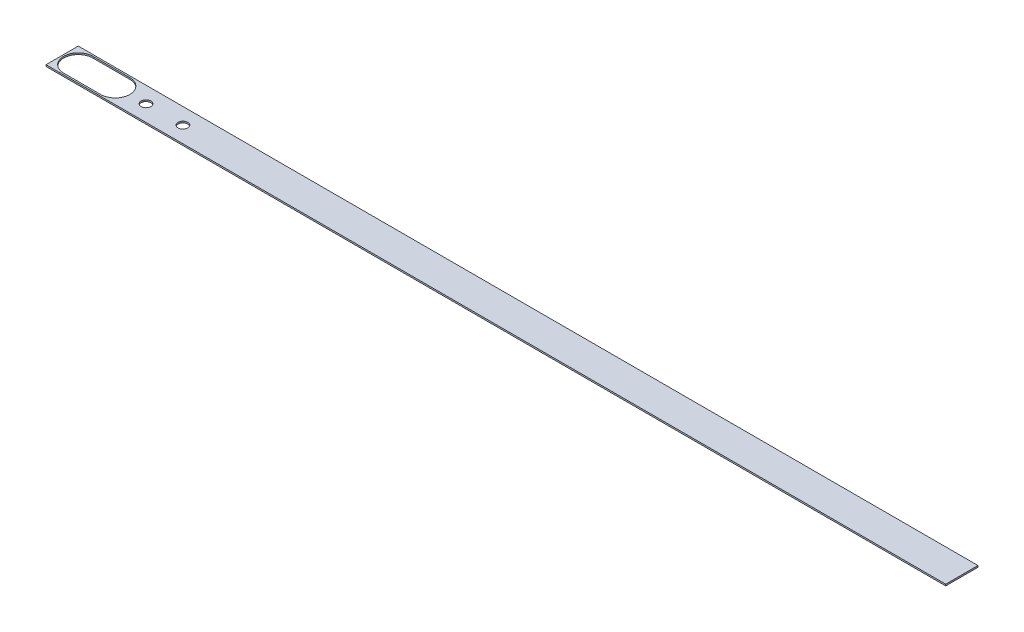
ISO-10303-21;
HEADER;
FILE_DESCRIPTION(('STEP AP214'),'2;1');
FILE_NAME('part.step','',(''),(''),'','','');
FILE_SCHEMA(('AUTOMOTIVE_DESIGN { 1 0 10303 214 1 1 1 1 }'));
ENDSEC;
DATA;
#1=APPLICATION_CONTEXT('core data for automotive mechanical design processes');
#2=APPLICATION_PROTOCOL_DEFINITION('international standard','automotive_design',2000,#1);
#3=PRODUCT_CONTEXT('',#1,'mechanical');
#4=PRODUCT('Part','Part','',(#3));
#5=PRODUCT_RELATED_PRODUCT_CATEGORY('part','',(#4));
#6=PRODUCT_DEFINITION_FORMATION('','',#4);
#7=PRODUCT_DEFINITION_CONTEXT('part definition',#1,'design');
#8=PRODUCT_DEFINITION('design','',#6,#7);
#9=PRODUCT_DEFINITION_SHAPE('','',#8);
#10=(LENGTH_UNIT() NAMED_UNIT(*) SI_UNIT(.MILLI.,.METRE.));
#11=(NAMED_UNIT(*) PLANE_ANGLE_UNIT() SI_UNIT($,.RADIAN.));
#12=(NAMED_UNIT(*) SI_UNIT($,.STERADIAN.) SOLID_ANGLE_UNIT());
#13=UNCERTAINTY_MEASURE_WITH_UNIT(LENGTH_MEASURE(1.E-05),#10,'distance_accuracy_value','');
#14=(GEOMETRIC_REPRESENTATION_CONTEXT(3) GLOBAL_UNCERTAINTY_ASSIGNED_CONTEXT((#13)) GLOBAL_UNIT_ASSIGNED_CONTEXT((#10,
#11,#12)) REPRESENTATION_CONTEXT('',''));
#15=CARTESIAN_POINT('',(0.,0.,0.));
#16=DIRECTION('',(0.,0.,1.));
#17=DIRECTION('',(1.,0.,0.));
#18=AXIS2_PLACEMENT_3D('',#15,#16,#17);
#19=CARTESIAN_POINT('',(462.5,-1.6,-16.6));
#20=DIRECTION('',(1.,0.,0.));
#21=DIRECTION('',(0.,0.,-1.));
#22=AXIS2_PLACEMENT_3D('',#19,#20,#21);
#23=PLANE('',#22);
#24=DIRECTION('',(0.,0.,-1.));
#25=VECTOR('',#24,1.);
#26=CARTESIAN_POINT('',(462.5,0.,-16.6));
#27=LINE('',#26,#25);
#28=CARTESIAN_POINT('',(462.5,0.,16.6));
#29=VERTEX_POINT('',#28);
#30=CARTESIAN_POINT('',(462.5,0.,-16.6));
#31=VERTEX_POINT('',#30);
#32=EDGE_CURVE('E165',#29,#31,#27,.T.);
#33=ORIENTED_EDGE('',*,*,#32,.F.);
#34=DIRECTION('',(0.,1.,0.));
#35=VECTOR('',#34,1.);
#36=CARTESIAN_POINT('',(462.5,-1.6,16.6));
#37=LINE('',#36,#35);
#38=CARTESIAN_POINT('',(462.5,-1.6,16.6));
#39=VERTEX_POINT('',#38);
#40=EDGE_CURVE('E12',#39,#29,#37,.T.);
#41=ORIENTED_EDGE('',*,*,#40,.F.);
#42=DIRECTION('',(0.,0.,-1.));
#43=VECTOR('',#42,1.);
#44=CARTESIAN_POINT('',(462.5,-1.6,-16.6));
#45=LINE('',#44,#43);
#46=CARTESIAN_POINT('',(462.5,-1.6,-16.6));
#47=VERTEX_POINT('',#46);
#48=EDGE_CURVE('E167',#39,#47,#45,.T.);
#49=ORIENTED_EDGE('',*,*,#48,.T.);
#50=DIRECTION('',(0.,1.,0.));
#51=VECTOR('',#50,1.);
#52=CARTESIAN_POINT('',(462.5,-1.6,-16.6));
#53=LINE('',#52,#51);
#54=EDGE_CURVE('E59',#47,#31,#53,.T.);
#55=ORIENTED_EDGE('',*,*,#54,.T.);
#56=EDGE_LOOP('',(#33,#41,#49,#55));
#57=FACE_BOUND('',#56,.T.);
#58=ADVANCED_FACE('F56',(#57),#23,.T.);
#59=CARTESIAN_POINT('',(-462.5,-1.6,16.6));
#60=DIRECTION('',(0.,0.,1.));
#61=DIRECTION('',(1.,0.,0.));
#62=AXIS2_PLACEMENT_3D('',#59,#60,#61);
#63=PLANE('',#62);
#64=DIRECTION('',(1.,0.,0.));
#65=VECTOR('',#64,1.);
#66=CARTESIAN_POINT('',(-462.5,0.,16.6));
#67=LINE('',#66,#65);
#68=CARTESIAN_POINT('',(-462.5,0.,16.6));
#69=VERTEX_POINT('',#68);
#70=EDGE_CURVE('E171',#69,#29,#67,.T.);
#71=ORIENTED_EDGE('',*,*,#70,.F.);
#72=DIRECTION('',(0.,1.,0.));
#73=VECTOR('',#72,1.);
#74=CARTESIAN_POINT('',(-462.5,-1.6,16.6));
#75=LINE('',#74,#73);
#76=CARTESIAN_POINT('',(-462.5,-1.6,16.6));
#77=VERTEX_POINT('',#76);
#78=EDGE_CURVE('E64',#77,#69,#75,.T.);
#79=ORIENTED_EDGE('',*,*,#78,.F.);
#80=DIRECTION('',(1.,0.,0.));
#81=VECTOR('',#80,1.);
#82=CARTESIAN_POINT('',(-462.5,-1.6,16.6));
#83=LINE('',#82,#81);
#84=EDGE_CURVE('E177',#77,#39,#83,.T.);
#85=ORIENTED_EDGE('',*,*,#84,.T.);
#86=ORIENTED_EDGE('',*,*,#40,.T.);
#87=EDGE_LOOP('',(#71,#79,#85,#86));
#88=FACE_BOUND('',#87,.T.);
#89=ADVANCED_FACE('F202',(#88),#63,.T.);
#90=CARTESIAN_POINT('',(-462.5,-1.6,-16.6));
#91=DIRECTION('',(-1.,0.,0.));
#92=DIRECTION('',(0.,0.,1.));
#93=AXIS2_PLACEMENT_3D('',#90,#91,#92);
#94=PLANE('',#93);
#95=DIRECTION('',(0.,0.,1.));
#96=VECTOR('',#95,1.);
#97=CARTESIAN_POINT('',(-462.5,0.,-16.6));
#98=LINE('',#97,#96);
#99=CARTESIAN_POINT('',(-462.5,0.,-16.6));
#100=VERTEX_POINT('',#99);
#101=EDGE_CURVE('E185',#100,#69,#98,.T.);
#102=ORIENTED_EDGE('',*,*,#101,.F.);
#103=DIRECTION('',(0.,1.,0.));
#104=VECTOR('',#103,1.);
#105=CARTESIAN_POINT('',(-462.5,-1.6,-16.6));
#106=LINE('',#105,#104);
#107=CARTESIAN_POINT('',(-462.5,-1.6,-16.6));
#108=VERTEX_POINT('',#107);
#109=EDGE_CURVE('E190',#108,#100,#106,.T.);
#110=ORIENTED_EDGE('',*,*,#109,.F.);
#111=DIRECTION('',(0.,0.,1.));
#112=VECTOR('',#111,1.);
#113=CARTESIAN_POINT('',(-462.5,-1.6,-16.6));
#114=LINE('',#113,#112);
#115=EDGE_CURVE('E174',#108,#77,#114,.T.);
#116=ORIENTED_EDGE('',*,*,#115,.T.);
#117=ORIENTED_EDGE('',*,*,#78,.T.);
#118=EDGE_LOOP('',(#102,#110,#116,#117));
#119=FACE_BOUND('',#118,.T.);
#120=ADVANCED_FACE('F208',(#119),#94,.T.);
#121=CARTESIAN_POINT('',(-462.5,-1.6,-16.6));
#122=DIRECTION('',(0.,0.,-1.));
#123=DIRECTION('',(-1.,0.,0.));
#124=AXIS2_PLACEMENT_3D('',#121,#122,#123);
#125=PLANE('',#124);
#126=DIRECTION('',(-1.,0.,0.));
#127=VECTOR('',#126,1.);
#128=CARTESIAN_POINT('',(-462.5,0.,-16.6));
#129=LINE('',#128,#127);
#130=EDGE_CURVE('E182',#31,#100,#129,.T.);
#131=ORIENTED_EDGE('',*,*,#130,.F.);
#132=ORIENTED_EDGE('',*,*,#54,.F.);
#133=DIRECTION('',(-1.,0.,0.));
#134=VECTOR('',#133,1.);
#135=CARTESIAN_POINT('',(-462.5,-1.6,-16.6));
#136=LINE('',#135,#134);
#137=EDGE_CURVE('E170',#47,#108,#136,.T.);
#138=ORIENTED_EDGE('',*,*,#137,.T.);
#139=ORIENTED_EDGE('',*,*,#109,.T.);
#140=EDGE_LOOP('',(#131,#132,#138,#139));
#141=FACE_BOUND('',#140,.T.);
#142=ADVANCED_FACE('F198',(#141),#125,.T.);
#143=CARTESIAN_POINT('',(0.,-1.6,0.));
#144=DIRECTION('',(0.,1.,0.));
#145=DIRECTION('',(0.,0.,1.));
#146=AXIS2_PLACEMENT_3D('',#143,#144,#145);
#147=PLANE('',#146);
#148=CARTESIAN_POINT('',(-338.3,-1.6,0.));
#149=DIRECTION('',(0.,1.,0.));
#150=DIRECTION('',(0.,0.,1.));
#151=AXIS2_PLACEMENT_3D('',#148,#149,#150);
#152=CIRCLE('',#151,4.99999999999999);
#153=CARTESIAN_POINT('',(-338.3,-1.6,4.99999999999999));
#154=VERTEX_POINT('',#153);
#155=EDGE_CURVE('E161',#154,#154,#152,.T.);
#156=ORIENTED_EDGE('',*,*,#155,.T.);
#157=EDGE_LOOP('',(#156));
#158=FACE_BOUND('',#157,.T.);
#159=DIRECTION('',(-1.,0.,0.));
#160=VECTOR('',#159,1.);
#161=CARTESIAN_POINT('',(-445.9,-1.6,-15.));
#162=LINE('',#161,#160);
#163=CARTESIAN_POINT('',(-407.9,-1.6,-15.));
#164=VERTEX_POINT('',#163);
#165=CARTESIAN_POINT('',(-445.9,-1.6,-15.));
#166=VERTEX_POINT('',#165);
#167=EDGE_CURVE('E151',#164,#166,#162,.T.);
#168=ORIENTED_EDGE('',*,*,#167,.T.);
#169=CARTESIAN_POINT('',(-445.9,-1.6,0.));
#170=DIRECTION('',(0.,1.,0.));
#171=DIRECTION('',(0.,0.,1.));
#172=AXIS2_PLACEMENT_3D('',#169,#170,#171);
#173=CIRCLE('',#172,15.);
#174=CARTESIAN_POINT('',(-445.9,-1.6,15.));
#175=VERTEX_POINT('',#174);
#176=EDGE_CURVE('E123',#166,#175,#173,.T.);
#177=ORIENTED_EDGE('',*,*,#176,.T.);
#178=DIRECTION('',(1.,0.,0.));
#179=VECTOR('',#178,1.);
#180=CARTESIAN_POINT('',(-445.9,-1.6,15.));
#181=LINE('',#180,#179);
#182=CARTESIAN_POINT('',(-407.9,-1.6,15.));
#183=VERTEX_POINT('',#182);
#184=EDGE_CURVE('E155',#175,#183,#181,.T.);
#185=ORIENTED_EDGE('',*,*,#184,.T.);
#186=CARTESIAN_POINT('',(-407.9,-1.6,0.));
#187=DIRECTION('',(0.,1.,0.));
#188=DIRECTION('',(0.,0.,1.));
#189=AXIS2_PLACEMENT_3D('',#186,#187,#188);
#190=CIRCLE('',#189,15.);
#191=EDGE_CURVE('E72',#183,#164,#190,.T.);
#192=ORIENTED_EDGE('',*,*,#191,.T.);
#193=EDGE_LOOP('',(#168,#177,#185,#192));
#194=FACE_BOUND('',#193,.T.);
#195=CARTESIAN_POINT('',(-376.3,-1.6,0.));
#196=DIRECTION('',(0.,1.,0.));
#197=DIRECTION('',(0.,0.,1.));
#198=AXIS2_PLACEMENT_3D('',#195,#196,#197);
#199=CIRCLE('',#198,4.99999999999999);
#200=CARTESIAN_POINT('',(-376.3,-1.6,4.99999999999999));
#201=VERTEX_POINT('',#200);
#202=EDGE_CURVE('E146',#201,#201,#199,.T.);
#203=ORIENTED_EDGE('',*,*,#202,.T.);
#204=EDGE_LOOP('',(#203));
#205=FACE_BOUND('',#204,.T.);
#206=ORIENTED_EDGE('',*,*,#48,.F.);
#207=ORIENTED_EDGE('',*,*,#84,.F.);
#208=ORIENTED_EDGE('',*,*,#115,.F.);
#209=ORIENTED_EDGE('',*,*,#137,.F.);
#210=EDGE_LOOP('',(#206,#207,#208,#209));
#211=FACE_BOUND('',#210,.T.);
#212=ADVANCED_FACE('F205',(#158,#194,#205,#211),#147,.F.);
#213=CARTESIAN_POINT('',(0.,0.,0.));
#214=DIRECTION('',(0.,1.,0.));
#215=DIRECTION('',(0.,0.,1.));
#216=AXIS2_PLACEMENT_3D('',#213,#214,#215);
#217=PLANE('',#216);
#218=CARTESIAN_POINT('',(-338.3,0.,0.));
#219=DIRECTION('',(0.,1.,0.));
#220=DIRECTION('',(0.,0.,1.));
#221=AXIS2_PLACEMENT_3D('',#218,#219,#220);
#222=CIRCLE('',#221,4.99999999999999);
#223=CARTESIAN_POINT('',(-338.3,0.,4.99999999999999));
#224=VERTEX_POINT('',#223);
#225=EDGE_CURVE('E128',#224,#224,#222,.T.);
#226=ORIENTED_EDGE('',*,*,#225,.F.);
#227=EDGE_LOOP('',(#226));
#228=FACE_BOUND('',#227,.T.);
#229=CARTESIAN_POINT('',(-445.9,0.,0.));
#230=DIRECTION('',(0.,1.,0.));
#231=DIRECTION('',(0.,0.,1.));
#232=AXIS2_PLACEMENT_3D('',#229,#230,#231);
#233=CIRCLE('',#232,15.);
#234=CARTESIAN_POINT('',(-445.9,0.,-15.));
#235=VERTEX_POINT('',#234);
#236=CARTESIAN_POINT('',(-445.9,0.,15.));
#237=VERTEX_POINT('',#236);
#238=EDGE_CURVE('E80',#235,#237,#233,.T.);
#239=ORIENTED_EDGE('',*,*,#238,.F.);
#240=DIRECTION('',(-1.,0.,0.));
#241=VECTOR('',#240,1.);
#242=CARTESIAN_POINT('',(-445.9,0.,-15.));
#243=LINE('',#242,#241);
#244=CARTESIAN_POINT('',(-407.9,0.,-15.));
#245=VERTEX_POINT('',#244);
#246=EDGE_CURVE('E131',#245,#235,#243,.T.);
#247=ORIENTED_EDGE('',*,*,#246,.F.);
#248=CARTESIAN_POINT('',(-407.9,0.,0.));
#249=DIRECTION('',(0.,1.,0.));
#250=DIRECTION('',(0.,0.,1.));
#251=AXIS2_PLACEMENT_3D('',#248,#249,#250);
#252=CIRCLE('',#251,15.);
#253=CARTESIAN_POINT('',(-407.9,0.,15.));
#254=VERTEX_POINT('',#253);
#255=EDGE_CURVE('E136',#254,#245,#252,.T.);
#256=ORIENTED_EDGE('',*,*,#255,.F.);
#257=DIRECTION('',(1.,0.,0.));
#258=VECTOR('',#257,1.);
#259=CARTESIAN_POINT('',(-445.9,0.,15.));
#260=LINE('',#259,#258);
#261=EDGE_CURVE('E142',#237,#254,#260,.T.);
#262=ORIENTED_EDGE('',*,*,#261,.F.);
#263=EDGE_LOOP('',(#239,#247,#256,#262));
#264=FACE_BOUND('',#263,.T.);
#265=CARTESIAN_POINT('',(-376.3,0.,0.));
#266=DIRECTION('',(0.,1.,0.));
#267=DIRECTION('',(0.,0.,1.));
#268=AXIS2_PLACEMENT_3D('',#265,#266,#267);
#269=CIRCLE('',#268,4.99999999999999);
#270=CARTESIAN_POINT('',(-376.3,0.,4.99999999999999));
#271=VERTEX_POINT('',#270);
#272=EDGE_CURVE('E143',#271,#271,#269,.T.);
#273=ORIENTED_EDGE('',*,*,#272,.F.);
#274=EDGE_LOOP('',(#273));
#275=FACE_BOUND('',#274,.T.);
#276=ORIENTED_EDGE('',*,*,#32,.T.);
#277=ORIENTED_EDGE('',*,*,#130,.T.);
#278=ORIENTED_EDGE('',*,*,#101,.T.);
#279=ORIENTED_EDGE('',*,*,#70,.T.);
#280=EDGE_LOOP('',(#276,#277,#278,#279));
#281=FACE_BOUND('',#280,.T.);
#282=ADVANCED_FACE('F139',(#228,#264,#275,#281),#217,.T.);
#283=CARTESIAN_POINT('',(-376.3,-1.6,0.));
#284=DIRECTION('',(0.,1.,0.));
#285=DIRECTION('',(0.,0.,1.));
#286=AXIS2_PLACEMENT_3D('',#283,#284,#285);
#287=CYLINDRICAL_SURFACE('',#286,4.99999999999999);
#288=ORIENTED_EDGE('',*,*,#202,.F.);
#289=EDGE_LOOP('',(#288));
#290=FACE_BOUND('',#289,.T.);
#291=ORIENTED_EDGE('',*,*,#272,.T.);
#292=EDGE_LOOP('',(#291));
#293=FACE_BOUND('',#292,.T.);
#294=ADVANCED_FACE('F253',(#290,#293),#287,.F.);
#295=CARTESIAN_POINT('',(-445.9,-1.6,0.));
#296=DIRECTION('',(0.,1.,0.));
#297=DIRECTION('',(0.,0.,1.));
#298=AXIS2_PLACEMENT_3D('',#295,#296,#297);
#299=CYLINDRICAL_SURFACE('',#298,15.);
#300=ORIENTED_EDGE('',*,*,#238,.T.);
#301=DIRECTION('',(0.,1.,0.));
#302=VECTOR('',#301,1.);
#303=CARTESIAN_POINT('',(-445.9,-1.6,15.));
#304=LINE('',#303,#302);
#305=EDGE_CURVE('E153',#175,#237,#304,.T.);
#306=ORIENTED_EDGE('',*,*,#305,.F.);
#307=ORIENTED_EDGE('',*,*,#176,.F.);
#308=DIRECTION('',(0.,1.,0.));
#309=VECTOR('',#308,1.);
#310=CARTESIAN_POINT('',(-445.9,-1.6,-15.));
#311=LINE('',#310,#309);
#312=EDGE_CURVE('E119',#166,#235,#311,.T.);
#313=ORIENTED_EDGE('',*,*,#312,.T.);
#314=EDGE_LOOP('',(#300,#306,#307,#313));
#315=FACE_BOUND('',#314,.T.);
#316=ADVANCED_FACE('F121',(#315),#299,.F.);
#317=CARTESIAN_POINT('',(-445.9,-1.6,-15.));
#318=DIRECTION('',(0.,0.,-1.));
#319=DIRECTION('',(-1.,0.,0.));
#320=AXIS2_PLACEMENT_3D('',#317,#318,#319);
#321=PLANE('',#320);
#322=ORIENTED_EDGE('',*,*,#246,.T.);
#323=ORIENTED_EDGE('',*,*,#312,.F.);
#324=ORIENTED_EDGE('',*,*,#167,.F.);
#325=DIRECTION('',(0.,1.,0.));
#326=VECTOR('',#325,1.);
#327=CARTESIAN_POINT('',(-407.9,-1.6,-15.));
#328=LINE('',#327,#326);
#329=EDGE_CURVE('E127',#164,#245,#328,.T.);
#330=ORIENTED_EDGE('',*,*,#329,.T.);
#331=EDGE_LOOP('',(#322,#323,#324,#330));
#332=FACE_BOUND('',#331,.T.);
#333=ADVANCED_FACE('F132',(#332),#321,.F.);
#334=CARTESIAN_POINT('',(-407.9,-1.6,0.));
#335=DIRECTION('',(0.,1.,0.));
#336=DIRECTION('',(0.,0.,1.));
#337=AXIS2_PLACEMENT_3D('',#334,#335,#336);
#338=CYLINDRICAL_SURFACE('',#337,15.);
#339=ORIENTED_EDGE('',*,*,#255,.T.);
#340=ORIENTED_EDGE('',*,*,#329,.F.);
#341=ORIENTED_EDGE('',*,*,#191,.F.);
#342=DIRECTION('',(0.,1.,0.));
#343=VECTOR('',#342,1.);
#344=CARTESIAN_POINT('',(-407.9,-1.6,15.));
#345=LINE('',#344,#343);
#346=EDGE_CURVE('E320',#183,#254,#345,.T.);
#347=ORIENTED_EDGE('',*,*,#346,.T.);
#348=EDGE_LOOP('',(#339,#340,#341,#347));
#349=FACE_BOUND('',#348,.T.);
#350=ADVANCED_FACE('F280',(#349),#338,.F.);
#351=CARTESIAN_POINT('',(-445.9,-1.6,15.));
#352=DIRECTION('',(0.,0.,1.));
#353=DIRECTION('',(1.,0.,0.));
#354=AXIS2_PLACEMENT_3D('',#351,#352,#353);
#355=PLANE('',#354);
#356=ORIENTED_EDGE('',*,*,#261,.T.);
#357=ORIENTED_EDGE('',*,*,#346,.F.);
#358=ORIENTED_EDGE('',*,*,#184,.F.);
#359=ORIENTED_EDGE('',*,*,#305,.T.);
#360=EDGE_LOOP('',(#356,#357,#358,#359));
#361=FACE_BOUND('',#360,.T.);
#362=ADVANCED_FACE('F289',(#361),#355,.F.);
#363=CARTESIAN_POINT('',(-338.3,-1.6,0.));
#364=DIRECTION('',(0.,1.,0.));
#365=DIRECTION('',(0.,0.,1.));
#366=AXIS2_PLACEMENT_3D('',#363,#364,#365);
#367=CYLINDRICAL_SURFACE('',#366,4.99999999999999);
#368=ORIENTED_EDGE('',*,*,#155,.F.);
#369=EDGE_LOOP('',(#368));
#370=FACE_BOUND('',#369,.T.);
#371=ORIENTED_EDGE('',*,*,#225,.T.);
#372=EDGE_LOOP('',(#371));
#373=FACE_BOUND('',#372,.T.);
#374=ADVANCED_FACE('F298',(#370,#373),#367,.F.);
#375=CLOSED_SHELL('',(#58,#89,#120,#142,#212,#282,#294,#316,#333,#350,#362,#374));
#376=MANIFOLD_SOLID_BREP('B2',#375);
#377=ADVANCED_BREP_SHAPE_REPRESENTATION('',(#18,#376),#14);
#378=SHAPE_DEFINITION_REPRESENTATION(#9,#377);
ENDSEC;
END-ISO-10303-21;
